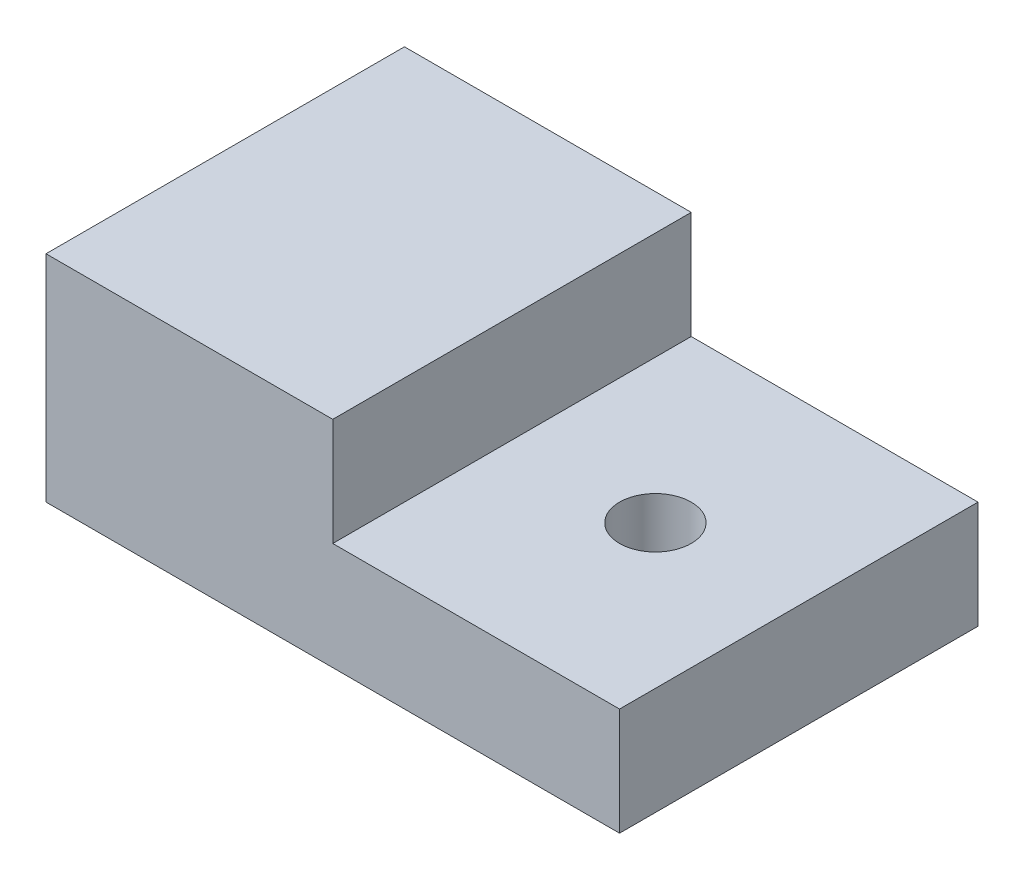
ISO-10303-21;
HEADER;
FILE_DESCRIPTION(('STEP AP214'),'2;1');
FILE_NAME('part.step','',(''),(''),'','','');
FILE_SCHEMA(('AUTOMOTIVE_DESIGN { 1 0 10303 214 1 1 1 1 }'));
ENDSEC;
DATA;
#1=APPLICATION_CONTEXT('core data for automotive mechanical design processes');
#2=APPLICATION_PROTOCOL_DEFINITION('international standard','automotive_design',2000,#1);
#3=PRODUCT_CONTEXT('',#1,'mechanical');
#4=PRODUCT('Part','Part','',(#3));
#5=PRODUCT_RELATED_PRODUCT_CATEGORY('part','',(#4));
#6=PRODUCT_DEFINITION_FORMATION('','',#4);
#7=PRODUCT_DEFINITION_CONTEXT('part definition',#1,'design');
#8=PRODUCT_DEFINITION('design','',#6,#7);
#9=PRODUCT_DEFINITION_SHAPE('','',#8);
#10=(LENGTH_UNIT() NAMED_UNIT(*) SI_UNIT(.MILLI.,.METRE.));
#11=(NAMED_UNIT(*) PLANE_ANGLE_UNIT() SI_UNIT($,.RADIAN.));
#12=(NAMED_UNIT(*) SI_UNIT($,.STERADIAN.) SOLID_ANGLE_UNIT());
#13=UNCERTAINTY_MEASURE_WITH_UNIT(LENGTH_MEASURE(1.E-05),#10,'distance_accuracy_value','');
#14=(GEOMETRIC_REPRESENTATION_CONTEXT(3) GLOBAL_UNCERTAINTY_ASSIGNED_CONTEXT((#13)) GLOBAL_UNIT_ASSIGNED_CONTEXT((#10,
#11,#12)) REPRESENTATION_CONTEXT('',''));
#15=CARTESIAN_POINT('',(0.,0.,0.));
#16=DIRECTION('',(0.,0.,1.));
#17=DIRECTION('',(1.,0.,0.));
#18=AXIS2_PLACEMENT_3D('',#15,#16,#17);
#19=CARTESIAN_POINT('',(-40.,30.,25.));
#20=DIRECTION('',(1.,0.,0.));
#21=DIRECTION('',(0.,0.,-1.));
#22=AXIS2_PLACEMENT_3D('',#19,#20,#21);
#23=PLANE('',#22);
#24=DIRECTION('',(0.,-1.,0.));
#25=VECTOR('',#24,1.);
#26=CARTESIAN_POINT('',(-40.,30.,-25.));
#27=LINE('',#26,#25);
#28=CARTESIAN_POINT('',(-40.,30.,-25.));
#29=VERTEX_POINT('',#28);
#30=CARTESIAN_POINT('',(-40.,0.,-25.));
#31=VERTEX_POINT('',#30);
#32=EDGE_CURVE('E143',#29,#31,#27,.T.);
#33=ORIENTED_EDGE('',*,*,#32,.T.);
#34=DIRECTION('',(0.,0.,-1.));
#35=VECTOR('',#34,1.);
#36=CARTESIAN_POINT('',(-40.,0.,25.));
#37=LINE('',#36,#35);
#38=CARTESIAN_POINT('',(-40.,0.,25.));
#39=VERTEX_POINT('',#38);
#40=EDGE_CURVE('E11',#39,#31,#37,.T.);
#41=ORIENTED_EDGE('',*,*,#40,.F.);
#42=DIRECTION('',(0.,-1.,0.));
#43=VECTOR('',#42,1.);
#44=CARTESIAN_POINT('',(-40.,30.,25.));
#45=LINE('',#44,#43);
#46=CARTESIAN_POINT('',(-40.,30.,25.));
#47=VERTEX_POINT('',#46);
#48=EDGE_CURVE('E159',#47,#39,#45,.T.);
#49=ORIENTED_EDGE('',*,*,#48,.F.);
#50=DIRECTION('',(0.,0.,-1.));
#51=VECTOR('',#50,1.);
#52=CARTESIAN_POINT('',(-40.,30.,25.));
#53=LINE('',#52,#51);
#54=EDGE_CURVE('E139',#47,#29,#53,.T.);
#55=ORIENTED_EDGE('',*,*,#54,.T.);
#56=EDGE_LOOP('',(#33,#41,#49,#55));
#57=FACE_BOUND('',#56,.T.);
#58=ADVANCED_FACE('F51',(#57),#23,.F.);
#59=CARTESIAN_POINT('',(-40.,0.,25.));
#60=DIRECTION('',(0.,1.,0.));
#61=DIRECTION('',(0.,0.,1.));
#62=AXIS2_PLACEMENT_3D('',#59,#60,#61);
#63=PLANE('',#62);
#64=DIRECTION('',(1.,0.,0.));
#65=VECTOR('',#64,1.);
#66=CARTESIAN_POINT('',(-40.,0.,-25.));
#67=LINE('',#66,#65);
#68=CARTESIAN_POINT('',(40.,0.,-25.));
#69=VERTEX_POINT('',#68);
#70=EDGE_CURVE('E146',#31,#69,#67,.T.);
#71=ORIENTED_EDGE('',*,*,#70,.T.);
#72=DIRECTION('',(0.,0.,-1.));
#73=VECTOR('',#72,1.);
#74=CARTESIAN_POINT('',(40.,0.,25.));
#75=LINE('',#74,#73);
#76=CARTESIAN_POINT('',(40.,0.,25.));
#77=VERTEX_POINT('',#76);
#78=EDGE_CURVE('E61',#77,#69,#75,.T.);
#79=ORIENTED_EDGE('',*,*,#78,.F.);
#80=DIRECTION('',(1.,0.,0.));
#81=VECTOR('',#80,1.);
#82=CARTESIAN_POINT('',(-40.,0.,25.));
#83=LINE('',#82,#81);
#84=EDGE_CURVE('E106',#39,#77,#83,.T.);
#85=ORIENTED_EDGE('',*,*,#84,.F.);
#86=ORIENTED_EDGE('',*,*,#40,.T.);
#87=EDGE_LOOP('',(#71,#79,#85,#86));
#88=FACE_BOUND('',#87,.T.);
#89=ADVANCED_FACE('F188',(#88),#63,.F.);
#90=CARTESIAN_POINT('',(40.,0.,25.));
#91=DIRECTION('',(-1.,0.,0.));
#92=DIRECTION('',(0.,0.,1.));
#93=AXIS2_PLACEMENT_3D('',#90,#91,#92);
#94=PLANE('',#93);
#95=DIRECTION('',(0.,1.,0.));
#96=VECTOR('',#95,1.);
#97=CARTESIAN_POINT('',(40.,0.,-25.));
#98=LINE('',#97,#96);
#99=CARTESIAN_POINT('',(40.,15.,-25.));
#100=VERTEX_POINT('',#99);
#101=EDGE_CURVE('E150',#69,#100,#98,.T.);
#102=ORIENTED_EDGE('',*,*,#101,.T.);
#103=DIRECTION('',(0.,0.,-1.));
#104=VECTOR('',#103,1.);
#105=CARTESIAN_POINT('',(40.,15.,25.));
#106=LINE('',#105,#104);
#107=CARTESIAN_POINT('',(40.,15.,25.));
#108=VERTEX_POINT('',#107);
#109=EDGE_CURVE('E130',#108,#100,#106,.T.);
#110=ORIENTED_EDGE('',*,*,#109,.F.);
#111=DIRECTION('',(0.,1.,0.));
#112=VECTOR('',#111,1.);
#113=CARTESIAN_POINT('',(40.,0.,25.));
#114=LINE('',#113,#112);
#115=EDGE_CURVE('E119',#77,#108,#114,.T.);
#116=ORIENTED_EDGE('',*,*,#115,.F.);
#117=ORIENTED_EDGE('',*,*,#78,.T.);
#118=EDGE_LOOP('',(#102,#110,#116,#117));
#119=FACE_BOUND('',#118,.T.);
#120=ADVANCED_FACE('F170',(#119),#94,.F.);
#121=CARTESIAN_POINT('',(40.,15.,25.));
#122=DIRECTION('',(0.,-1.,0.));
#123=DIRECTION('',(0.,0.,-1.));
#124=AXIS2_PLACEMENT_3D('',#121,#122,#123);
#125=PLANE('',#124);
#126=CARTESIAN_POINT('',(20.,15.,0.));
#127=DIRECTION('',(0.,1.,0.));
#128=DIRECTION('',(0.,0.,1.));
#129=AXIS2_PLACEMENT_3D('',#126,#127,#128);
#130=CIRCLE('',#129,5.);
#131=CARTESIAN_POINT('',(20.,15.,5.));
#132=VERTEX_POINT('',#131);
#133=EDGE_CURVE('E216',#132,#132,#130,.T.);
#134=ORIENTED_EDGE('',*,*,#133,.F.);
#135=EDGE_LOOP('',(#134));
#136=FACE_BOUND('',#135,.T.);
#137=DIRECTION('',(-1.,0.,0.));
#138=VECTOR('',#137,1.);
#139=CARTESIAN_POINT('',(40.,15.,-25.));
#140=LINE('',#139,#138);
#141=CARTESIAN_POINT('',(0.,15.,-25.));
#142=VERTEX_POINT('',#141);
#143=EDGE_CURVE('E128',#100,#142,#140,.T.);
#144=ORIENTED_EDGE('',*,*,#143,.T.);
#145=DIRECTION('',(0.,0.,-1.));
#146=VECTOR('',#145,1.);
#147=CARTESIAN_POINT('',(0.,15.,25.));
#148=LINE('',#147,#146);
#149=CARTESIAN_POINT('',(0.,15.,25.));
#150=VERTEX_POINT('',#149);
#151=EDGE_CURVE('E125',#150,#142,#148,.T.);
#152=ORIENTED_EDGE('',*,*,#151,.F.);
#153=DIRECTION('',(-1.,0.,0.));
#154=VECTOR('',#153,1.);
#155=CARTESIAN_POINT('',(40.,15.,25.));
#156=LINE('',#155,#154);
#157=EDGE_CURVE('E113',#108,#150,#156,.T.);
#158=ORIENTED_EDGE('',*,*,#157,.F.);
#159=ORIENTED_EDGE('',*,*,#109,.T.);
#160=EDGE_LOOP('',(#144,#152,#158,#159));
#161=FACE_BOUND('',#160,.T.);
#162=ADVANCED_FACE('F126',(#136,#161),#125,.F.);
#163=CARTESIAN_POINT('',(0.,15.,25.));
#164=DIRECTION('',(-1.,0.,0.));
#165=DIRECTION('',(0.,0.,1.));
#166=AXIS2_PLACEMENT_3D('',#163,#164,#165);
#167=PLANE('',#166);
#168=DIRECTION('',(0.,1.,0.));
#169=VECTOR('',#168,1.);
#170=CARTESIAN_POINT('',(0.,15.,-25.));
#171=LINE('',#170,#169);
#172=CARTESIAN_POINT('',(0.,30.,-25.));
#173=VERTEX_POINT('',#172);
#174=EDGE_CURVE('E92',#142,#173,#171,.T.);
#175=ORIENTED_EDGE('',*,*,#174,.T.);
#176=DIRECTION('',(0.,0.,-1.));
#177=VECTOR('',#176,1.);
#178=CARTESIAN_POINT('',(0.,30.,25.));
#179=LINE('',#178,#177);
#180=CARTESIAN_POINT('',(0.,30.,25.));
#181=VERTEX_POINT('',#180);
#182=EDGE_CURVE('E131',#181,#173,#179,.T.);
#183=ORIENTED_EDGE('',*,*,#182,.F.);
#184=DIRECTION('',(0.,1.,0.));
#185=VECTOR('',#184,1.);
#186=CARTESIAN_POINT('',(0.,15.,25.));
#187=LINE('',#186,#185);
#188=EDGE_CURVE('E117',#150,#181,#187,.T.);
#189=ORIENTED_EDGE('',*,*,#188,.F.);
#190=ORIENTED_EDGE('',*,*,#151,.T.);
#191=EDGE_LOOP('',(#175,#183,#189,#190));
#192=FACE_BOUND('',#191,.T.);
#193=ADVANCED_FACE('F133',(#192),#167,.F.);
#194=CARTESIAN_POINT('',(0.,30.,25.));
#195=DIRECTION('',(0.,-1.,0.));
#196=DIRECTION('',(0.,0.,-1.));
#197=AXIS2_PLACEMENT_3D('',#194,#195,#196);
#198=PLANE('',#197);
#199=DIRECTION('',(-1.,0.,0.));
#200=VECTOR('',#199,1.);
#201=CARTESIAN_POINT('',(0.,30.,-25.));
#202=LINE('',#201,#200);
#203=EDGE_CURVE('E98',#173,#29,#202,.T.);
#204=ORIENTED_EDGE('',*,*,#203,.T.);
#205=ORIENTED_EDGE('',*,*,#54,.F.);
#206=DIRECTION('',(-1.,0.,0.));
#207=VECTOR('',#206,1.);
#208=CARTESIAN_POINT('',(0.,30.,25.));
#209=LINE('',#208,#207);
#210=EDGE_CURVE('E69',#181,#47,#209,.T.);
#211=ORIENTED_EDGE('',*,*,#210,.F.);
#212=ORIENTED_EDGE('',*,*,#182,.T.);
#213=EDGE_LOOP('',(#204,#205,#211,#212));
#214=FACE_BOUND('',#213,.T.);
#215=ADVANCED_FACE('F177',(#214),#198,.F.);
#216=CARTESIAN_POINT('',(0.,0.,25.));
#217=DIRECTION('',(0.,0.,1.));
#218=DIRECTION('',(1.,0.,0.));
#219=AXIS2_PLACEMENT_3D('',#216,#217,#218);
#220=PLANE('',#219);
#221=ORIENTED_EDGE('',*,*,#48,.T.);
#222=ORIENTED_EDGE('',*,*,#84,.T.);
#223=ORIENTED_EDGE('',*,*,#115,.T.);
#224=ORIENTED_EDGE('',*,*,#157,.T.);
#225=ORIENTED_EDGE('',*,*,#188,.T.);
#226=ORIENTED_EDGE('',*,*,#210,.T.);
#227=EDGE_LOOP('',(#221,#222,#223,#224,#225,#226));
#228=FACE_BOUND('',#227,.T.);
#229=ADVANCED_FACE('F115',(#228),#220,.T.);
#230=CARTESIAN_POINT('',(0.,0.,-25.));
#231=DIRECTION('',(0.,0.,1.));
#232=DIRECTION('',(1.,0.,0.));
#233=AXIS2_PLACEMENT_3D('',#230,#231,#232);
#234=PLANE('',#233);
#235=ORIENTED_EDGE('',*,*,#32,.F.);
#236=ORIENTED_EDGE('',*,*,#203,.F.);
#237=ORIENTED_EDGE('',*,*,#174,.F.);
#238=ORIENTED_EDGE('',*,*,#143,.F.);
#239=ORIENTED_EDGE('',*,*,#101,.F.);
#240=ORIENTED_EDGE('',*,*,#70,.F.);
#241=EDGE_LOOP('',(#235,#236,#237,#238,#239,#240));
#242=FACE_BOUND('',#241,.T.);
#243=ADVANCED_FACE('F173',(#242),#234,.F.);
#244=CARTESIAN_POINT('',(20.,7.,0.));
#245=DIRECTION('',(0.,1.,0.));
#246=DIRECTION('',(0.,0.,1.));
#247=AXIS2_PLACEMENT_3D('',#244,#245,#246);
#248=CYLINDRICAL_SURFACE('',#247,5.);
#249=CARTESIAN_POINT('',(20.,7.,0.));
#250=DIRECTION('',(0.,1.,0.));
#251=DIRECTION('',(0.,0.,1.));
#252=AXIS2_PLACEMENT_3D('',#249,#250,#251);
#253=CIRCLE('',#252,5.);
#254=CARTESIAN_POINT('',(20.,7.,5.));
#255=VERTEX_POINT('',#254);
#256=EDGE_CURVE('E147',#255,#255,#253,.T.);
#257=ORIENTED_EDGE('',*,*,#256,.F.);
#258=EDGE_LOOP('',(#257));
#259=FACE_BOUND('',#258,.T.);
#260=ORIENTED_EDGE('',*,*,#133,.T.);
#261=EDGE_LOOP('',(#260));
#262=FACE_BOUND('',#261,.T.);
#263=ADVANCED_FACE('F206',(#259,#262),#248,.F.);
#264=CARTESIAN_POINT('',(20.,7.,0.));
#265=DIRECTION('',(0.,1.,0.));
#266=DIRECTION('',(0.,0.,1.));
#267=AXIS2_PLACEMENT_3D('',#264,#265,#266);
#268=PLANE('',#267);
#269=ORIENTED_EDGE('',*,*,#256,.T.);
#270=EDGE_LOOP('',(#269));
#271=FACE_BOUND('',#270,.T.);
#272=ADVANCED_FACE('F208',(#271),#268,.T.);
#273=CLOSED_SHELL('',(#58,#89,#120,#162,#193,#215,#229,#243,#263,#272));
#274=MANIFOLD_SOLID_BREP('B2',#273);
#275=ADVANCED_BREP_SHAPE_REPRESENTATION('',(#18,#274),#14);
#276=SHAPE_DEFINITION_REPRESENTATION(#9,#275);
ENDSEC;
END-ISO-10303-21;
